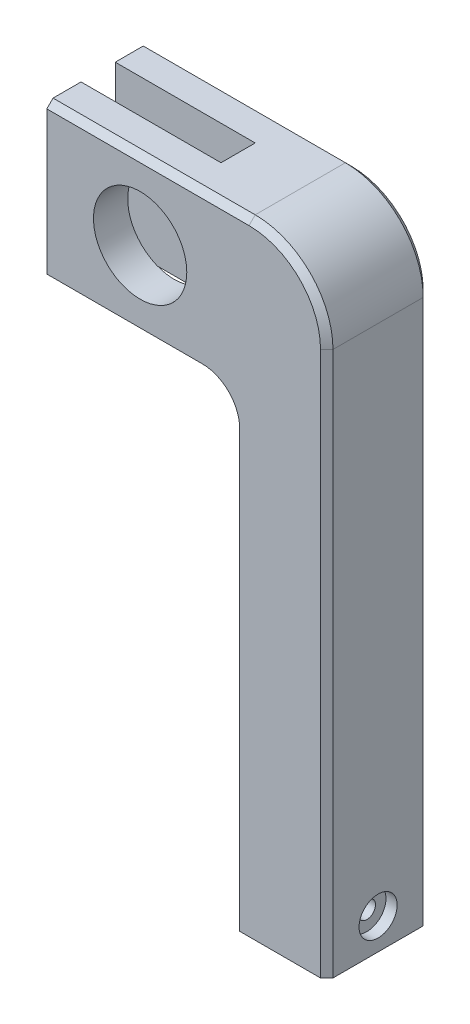
ISO-10303-21;
HEADER;
FILE_DESCRIPTION(('STEP AP214'),'2;1');
FILE_NAME('part.step','',(''),(''),'','','');
FILE_SCHEMA(('AUTOMOTIVE_DESIGN { 1 0 10303 214 1 1 1 1 }'));
ENDSEC;
DATA;
#1=APPLICATION_CONTEXT('core data for automotive mechanical design processes');
#2=APPLICATION_PROTOCOL_DEFINITION('international standard','automotive_design',2000,#1);
#3=PRODUCT_CONTEXT('',#1,'mechanical');
#4=PRODUCT('Part','Part','',(#3));
#5=PRODUCT_RELATED_PRODUCT_CATEGORY('part','',(#4));
#6=PRODUCT_DEFINITION_FORMATION('','',#4);
#7=PRODUCT_DEFINITION_CONTEXT('part definition',#1,'design');
#8=PRODUCT_DEFINITION('design','',#6,#7);
#9=PRODUCT_DEFINITION_SHAPE('','',#8);
#10=(LENGTH_UNIT() NAMED_UNIT(*) SI_UNIT(.MILLI.,.METRE.));
#11=(NAMED_UNIT(*) PLANE_ANGLE_UNIT() SI_UNIT($,.RADIAN.));
#12=(NAMED_UNIT(*) SI_UNIT($,.STERADIAN.) SOLID_ANGLE_UNIT());
#13=UNCERTAINTY_MEASURE_WITH_UNIT(LENGTH_MEASURE(1.E-05),#10,'distance_accuracy_value','');
#14=(GEOMETRIC_REPRESENTATION_CONTEXT(3) GLOBAL_UNCERTAINTY_ASSIGNED_CONTEXT((#13)) GLOBAL_UNIT_ASSIGNED_CONTEXT((#10,
#11,#12)) REPRESENTATION_CONTEXT('',''));
#15=CARTESIAN_POINT('',(0.,0.,0.));
#16=DIRECTION('',(0.,0.,1.));
#17=DIRECTION('',(1.,0.,0.));
#18=AXIS2_PLACEMENT_3D('',#15,#16,#17);
#19=CARTESIAN_POINT('',(-90.,150.,-16.5));
#20=DIRECTION('',(-1.,0.,0.));
#21=DIRECTION('',(0.,0.,1.));
#22=AXIS2_PLACEMENT_3D('',#19,#20,#21);
#23=PLANE('',#22);
#24=CARTESIAN_POINT('',(-90.,195.,-11.));
#25=DIRECTION('',(-1.,0.,0.));
#26=DIRECTION('',(0.,0.,1.));
#27=AXIS2_PLACEMENT_3D('',#24,#25,#26);
#28=CIRCLE('',#27,1.5);
#29=CARTESIAN_POINT('',(-90.,195.,-9.5));
#30=VERTEX_POINT('',#29);
#31=EDGE_CURVE('E213',#30,#30,#28,.T.);
#32=ORIENTED_EDGE('',*,*,#31,.F.);
#33=EDGE_LOOP('',(#32));
#34=FACE_BOUND('',#33,.T.);
#35=CARTESIAN_POINT('',(-90.,155.,-11.));
#36=DIRECTION('',(-1.,0.,0.));
#37=DIRECTION('',(0.,0.,1.));
#38=AXIS2_PLACEMENT_3D('',#35,#36,#37);
#39=CIRCLE('',#38,1.5);
#40=CARTESIAN_POINT('',(-90.,155.,-9.5));
#41=VERTEX_POINT('',#40);
#42=EDGE_CURVE('E215',#41,#41,#39,.T.);
#43=ORIENTED_EDGE('',*,*,#42,.F.);
#44=EDGE_LOOP('',(#43));
#45=FACE_BOUND('',#44,.T.);
#46=DIRECTION('',(0.,-1.,0.));
#47=VECTOR('',#46,1.);
#48=CARTESIAN_POINT('',(-90.,150.,-16.5));
#49=LINE('',#48,#47);
#50=CARTESIAN_POINT('',(-90.,198.,-16.5));
#51=VERTEX_POINT('',#50);
#52=CARTESIAN_POINT('',(-90.,152.,-16.5));
#53=VERTEX_POINT('',#52);
#54=EDGE_CURVE('E298',#51,#53,#49,.T.);
#55=ORIENTED_EDGE('',*,*,#54,.T.);
#56=DIRECTION('',(0.,0.707106781186552,-0.707106781186543));
#57=VECTOR('',#56,1.);
#58=CARTESIAN_POINT('',(-90.,151.,-15.5));
#59=LINE('',#58,#57);
#60=CARTESIAN_POINT('',(-90.,150.,-14.5));
#61=VERTEX_POINT('',#60);
#62=EDGE_CURVE('E421',#53,#61,#59,.F.);
#63=ORIENTED_EDGE('',*,*,#62,.T.);
#64=DIRECTION('',(0.,0.,1.));
#65=VECTOR('',#64,1.);
#66=CARTESIAN_POINT('',(-90.,150.,-16.5));
#67=LINE('',#66,#65);
#68=CARTESIAN_POINT('',(-90.,150.,-5.5));
#69=VERTEX_POINT('',#68);
#70=EDGE_CURVE('E322',#61,#69,#67,.T.);
#71=ORIENTED_EDGE('',*,*,#70,.T.);
#72=DIRECTION('',(0.,1.,0.));
#73=VECTOR('',#72,1.);
#74=CARTESIAN_POINT('',(-90.,-0.001000000000001,-5.5));
#75=LINE('',#74,#73);
#76=CARTESIAN_POINT('',(-90.,200.,-5.5));
#77=VERTEX_POINT('',#76);
#78=EDGE_CURVE('E278',#69,#77,#75,.T.);
#79=ORIENTED_EDGE('',*,*,#78,.T.);
#80=DIRECTION('',(0.,0.,1.));
#81=VECTOR('',#80,1.);
#82=CARTESIAN_POINT('',(-90.,200.,-16.5));
#83=LINE('',#82,#81);
#84=CARTESIAN_POINT('',(-90.,200.,-14.5));
#85=VERTEX_POINT('',#84);
#86=EDGE_CURVE('E327',#85,#77,#83,.T.);
#87=ORIENTED_EDGE('',*,*,#86,.F.);
#88=DIRECTION('',(0.,0.707106781186552,0.707106781186543));
#89=VECTOR('',#88,1.);
#90=CARTESIAN_POINT('',(-90.,174.,-40.5));
#91=LINE('',#90,#89);
#92=EDGE_CURVE('E419',#85,#51,#91,.F.);
#93=ORIENTED_EDGE('',*,*,#92,.T.);
#94=EDGE_LOOP('',(#55,#63,#71,#79,#87,#93));
#95=FACE_BOUND('',#94,.T.);
#96=ADVANCED_FACE('F50',(#34,#45,#95),#23,.T.);
#97=CARTESIAN_POINT('',(-30.,150.,-16.5));
#98=DIRECTION('',(0.,-1.,0.));
#99=DIRECTION('',(0.,0.,-1.));
#100=AXIS2_PLACEMENT_3D('',#97,#98,#99);
#101=PLANE('',#100);
#102=DIRECTION('',(0.,0.,1.));
#103=VECTOR('',#102,1.);
#104=CARTESIAN_POINT('',(-40.,150.,16.5));
#105=LINE('',#104,#103);
#106=CARTESIAN_POINT('',(-40.,150.,-14.5));
#107=VERTEX_POINT('',#106);
#108=CARTESIAN_POINT('',(-40.,150.,14.4999999999999));
#109=VERTEX_POINT('',#108);
#110=EDGE_CURVE('E337',#107,#109,#105,.T.);
#111=ORIENTED_EDGE('',*,*,#110,.T.);
#112=DIRECTION('',(-1.,0.,0.));
#113=VECTOR('',#112,1.);
#114=CARTESIAN_POINT('',(-90.,150.,14.4999999999999));
#115=LINE('',#114,#113);
#116=CARTESIAN_POINT('',(-90.,150.,14.4999999999999));
#117=VERTEX_POINT('',#116);
#118=EDGE_CURVE('E369',#109,#117,#115,.T.);
#119=ORIENTED_EDGE('',*,*,#118,.T.);
#120=CARTESIAN_POINT('',(-90.,150.,5.5));
#121=VERTEX_POINT('',#120);
#122=EDGE_CURVE('E330',#121,#117,#67,.T.);
#123=ORIENTED_EDGE('',*,*,#122,.F.);
#124=DIRECTION('',(1.,0.,0.));
#125=VECTOR('',#124,1.);
#126=CARTESIAN_POINT('',(-45.,150.,5.49999999999999));
#127=LINE('',#126,#125);
#128=CARTESIAN_POINT('',(-45.,150.,5.49999999999999));
#129=VERTEX_POINT('',#128);
#130=EDGE_CURVE('E283',#121,#129,#127,.T.);
#131=ORIENTED_EDGE('',*,*,#130,.T.);
#132=DIRECTION('',(0.,0.,-1.));
#133=VECTOR('',#132,1.);
#134=CARTESIAN_POINT('',(-45.,150.,5.49999999999999));
#135=LINE('',#134,#133);
#136=CARTESIAN_POINT('',(-45.,150.,-5.49999999999999));
#137=VERTEX_POINT('',#136);
#138=EDGE_CURVE('E259',#129,#137,#135,.T.);
#139=ORIENTED_EDGE('',*,*,#138,.T.);
#140=DIRECTION('',(-1.,0.,0.));
#141=VECTOR('',#140,1.);
#142=CARTESIAN_POINT('',(-45.,150.,-5.49999999999999));
#143=LINE('',#142,#141);
#144=EDGE_CURVE('E263',#137,#69,#143,.T.);
#145=ORIENTED_EDGE('',*,*,#144,.T.);
#146=ORIENTED_EDGE('',*,*,#70,.F.);
#147=DIRECTION('',(1.,0.,0.));
#148=VECTOR('',#147,1.);
#149=CARTESIAN_POINT('',(-30.,150.,-14.5));
#150=LINE('',#149,#148);
#151=EDGE_CURVE('E364',#61,#107,#150,.T.);
#152=ORIENTED_EDGE('',*,*,#151,.T.);
#153=EDGE_LOOP('',(#111,#119,#123,#131,#139,#145,#146,#152));
#154=FACE_BOUND('',#153,.T.);
#155=ADVANCED_FACE('F492',(#154),#101,.T.);
#156=CARTESIAN_POINT('',(0.,200.,-16.5));
#157=DIRECTION('',(1.,0.,0.));
#158=DIRECTION('',(0.,1.,0.));
#159=AXIS2_PLACEMENT_3D('',#156,#157,#158);
#160=PLANE('',#159);
#161=CARTESIAN_POINT('',(0.,10.,0.));
#162=DIRECTION('',(1.,0.,0.));
#163=DIRECTION('',(0.,0.,-1.));
#164=AXIS2_PLACEMENT_3D('',#161,#162,#163);
#165=CIRCLE('',#164,6.12);
#166=CARTESIAN_POINT('',(0.,10.,-6.12));
#167=VERTEX_POINT('',#166);
#168=EDGE_CURVE('E483',#167,#167,#165,.T.);
#169=ORIENTED_EDGE('',*,*,#168,.F.);
#170=EDGE_LOOP('',(#169));
#171=FACE_BOUND('',#170,.T.);
#172=DIRECTION('',(0.,0.,1.));
#173=VECTOR('',#172,1.);
#174=CARTESIAN_POINT('',(0.,0.,-16.5));
#175=LINE('',#174,#173);
#176=CARTESIAN_POINT('',(0.,0.,-14.5));
#177=VERTEX_POINT('',#176);
#178=CARTESIAN_POINT('',(0.,0.,14.4999999999999));
#179=VERTEX_POINT('',#178);
#180=EDGE_CURVE('E312',#177,#179,#175,.T.);
#181=ORIENTED_EDGE('',*,*,#180,.F.);
#182=DIRECTION('',(0.,1.,0.));
#183=VECTOR('',#182,1.);
#184=CARTESIAN_POINT('',(0.,200.,-14.5));
#185=LINE('',#184,#183);
#186=CARTESIAN_POINT('',(0.,175.,-14.5));
#187=VERTEX_POINT('',#186);
#188=EDGE_CURVE('E11',#177,#187,#185,.T.);
#189=ORIENTED_EDGE('',*,*,#188,.T.);
#190=DIRECTION('',(0.,0.,1.));
#191=VECTOR('',#190,1.);
#192=CARTESIAN_POINT('',(0.,175.,-16.5));
#193=LINE('',#192,#191);
#194=CARTESIAN_POINT('',(0.,175.,14.4999999999999));
#195=VERTEX_POINT('',#194);
#196=EDGE_CURVE('E317',#187,#195,#193,.T.);
#197=ORIENTED_EDGE('',*,*,#196,.T.);
#198=DIRECTION('',(0.,-1.,0.));
#199=VECTOR('',#198,1.);
#200=CARTESIAN_POINT('',(0.,0.,14.4999999999999));
#201=LINE('',#200,#199);
#202=EDGE_CURVE('E59',#195,#179,#201,.T.);
#203=ORIENTED_EDGE('',*,*,#202,.T.);
#204=EDGE_LOOP('',(#181,#189,#197,#203));
#205=FACE_BOUND('',#204,.T.);
#206=ADVANCED_FACE('F489',(#171,#205),#160,.T.);
#207=CARTESIAN_POINT('',(0.,0.,-16.5));
#208=DIRECTION('',(0.,-1.,0.));
#209=DIRECTION('',(1.,0.,0.));
#210=AXIS2_PLACEMENT_3D('',#207,#208,#209);
#211=PLANE('',#210);
#212=DIRECTION('',(1.,0.,0.));
#213=VECTOR('',#212,1.);
#214=CARTESIAN_POINT('',(0.,0.,16.5));
#215=LINE('',#214,#213);
#216=CARTESIAN_POINT('',(-28.,0.,16.5));
#217=VERTEX_POINT('',#216);
#218=CARTESIAN_POINT('',(-2.00000000000003,0.,16.5));
#219=VERTEX_POINT('',#218);
#220=EDGE_CURVE('E303',#217,#219,#215,.T.);
#221=ORIENTED_EDGE('',*,*,#220,.F.);
#222=DIRECTION('',(-0.707106781186543,0.,-0.707106781186552));
#223=VECTOR('',#222,1.);
#224=CARTESIAN_POINT('',(-30.5000000000002,0.,13.9999999999998));
#225=LINE('',#224,#223);
#226=CARTESIAN_POINT('',(-30.,0.,14.4999999999999));
#227=VERTEX_POINT('',#226);
#228=EDGE_CURVE('E394',#217,#227,#225,.T.);
#229=ORIENTED_EDGE('',*,*,#228,.T.);
#230=DIRECTION('',(0.,0.,1.));
#231=VECTOR('',#230,1.);
#232=CARTESIAN_POINT('',(-30.,0.,-16.5));
#233=LINE('',#232,#231);
#234=CARTESIAN_POINT('',(-30.,0.,-14.5));
#235=VERTEX_POINT('',#234);
#236=EDGE_CURVE('E319',#235,#227,#233,.T.);
#237=ORIENTED_EDGE('',*,*,#236,.F.);
#238=DIRECTION('',(-0.707106781186552,0.,0.707106781186543));
#239=VECTOR('',#238,1.);
#240=CARTESIAN_POINT('',(-13.9999999999998,0.,-30.5));
#241=LINE('',#240,#239);
#242=CARTESIAN_POINT('',(-28.,0.,-16.5));
#243=VERTEX_POINT('',#242);
#244=EDGE_CURVE('E388',#235,#243,#241,.F.);
#245=ORIENTED_EDGE('',*,*,#244,.T.);
#246=DIRECTION('',(1.,0.,0.));
#247=VECTOR('',#246,1.);
#248=CARTESIAN_POINT('',(0.,0.,-16.5));
#249=LINE('',#248,#247);
#250=CARTESIAN_POINT('',(-2.00000000000006,0.,-16.5));
#251=VERTEX_POINT('',#250);
#252=EDGE_CURVE('E305',#243,#251,#249,.T.);
#253=ORIENTED_EDGE('',*,*,#252,.T.);
#254=DIRECTION('',(-0.707106781186552,0.,-0.707106781186543));
#255=VECTOR('',#254,1.);
#256=CARTESIAN_POINT('',(-1.00000000000001,0.,-15.5));
#257=LINE('',#256,#255);
#258=EDGE_CURVE('E390',#251,#177,#257,.F.);
#259=ORIENTED_EDGE('',*,*,#258,.T.);
#260=ORIENTED_EDGE('',*,*,#180,.T.);
#261=DIRECTION('',(-0.707106781186543,0.,0.707106781186552));
#262=VECTOR('',#261,1.);
#263=CARTESIAN_POINT('',(15.5,0.,-1.00000000000024));
#264=LINE('',#263,#262);
#265=EDGE_CURVE('E383',#179,#219,#264,.T.);
#266=ORIENTED_EDGE('',*,*,#265,.T.);
#267=EDGE_LOOP('',(#221,#229,#237,#245,#253,#259,#260,#266));
#268=FACE_BOUND('',#267,.T.);
#269=ADVANCED_FACE('F495',(#268),#211,.T.);
#270=CARTESIAN_POINT('',(-30.,150.,-16.5));
#271=DIRECTION('',(-1.,0.,0.));
#272=DIRECTION('',(0.,-1.,0.));
#273=AXIS2_PLACEMENT_3D('',#270,#271,#272);
#274=PLANE('',#273);
#275=CARTESIAN_POINT('',(-30.,10.,0.));
#276=DIRECTION('',(-1.,0.,0.));
#277=DIRECTION('',(0.,-1.,0.));
#278=AXIS2_PLACEMENT_3D('',#275,#276,#277);
#279=CIRCLE('',#278,2.75);
#280=CARTESIAN_POINT('',(-30.,7.25,0.));
#281=VERTEX_POINT('',#280);
#282=EDGE_CURVE('E464',#281,#281,#279,.T.);
#283=ORIENTED_EDGE('',*,*,#282,.F.);
#284=EDGE_LOOP('',(#283));
#285=FACE_BOUND('',#284,.T.);
#286=ORIENTED_EDGE('',*,*,#236,.T.);
#287=DIRECTION('',(0.,1.,0.));
#288=VECTOR('',#287,1.);
#289=CARTESIAN_POINT('',(-30.,140.,14.4999999999999));
#290=LINE('',#289,#288);
#291=CARTESIAN_POINT('',(-30.,140.,14.4999999999999));
#292=VERTEX_POINT('',#291);
#293=EDGE_CURVE('E398',#227,#292,#290,.T.);
#294=ORIENTED_EDGE('',*,*,#293,.T.);
#295=DIRECTION('',(0.,0.,1.));
#296=VECTOR('',#295,1.);
#297=CARTESIAN_POINT('',(-30.,140.,-16.5));
#298=LINE('',#297,#296);
#299=CARTESIAN_POINT('',(-30.,140.,-14.5));
#300=VERTEX_POINT('',#299);
#301=EDGE_CURVE('E344',#292,#300,#298,.F.);
#302=ORIENTED_EDGE('',*,*,#301,.T.);
#303=DIRECTION('',(0.,-1.,0.));
#304=VECTOR('',#303,1.);
#305=CARTESIAN_POINT('',(-30.,150.,-14.5));
#306=LINE('',#305,#304);
#307=EDGE_CURVE('E399',#300,#235,#306,.T.);
#308=ORIENTED_EDGE('',*,*,#307,.T.);
#309=EDGE_LOOP('',(#286,#294,#302,#308));
#310=FACE_BOUND('',#309,.T.);
#311=ADVANCED_FACE('F561',(#285,#310),#274,.T.);
#312=CARTESIAN_POINT('',(-90.,195.,11.));
#313=DIRECTION('',(-1.,0.,0.));
#314=DIRECTION('',(0.,0.,1.));
#315=AXIS2_PLACEMENT_3D('',#312,#313,#314);
#316=CIRCLE('',#315,1.5);
#317=CARTESIAN_POINT('',(-90.,195.,12.5));
#318=VERTEX_POINT('',#317);
#319=EDGE_CURVE('E229',#318,#318,#316,.T.);
#320=ORIENTED_EDGE('',*,*,#319,.F.);
#321=EDGE_LOOP('',(#320));
#322=FACE_BOUND('',#321,.T.);
#323=CARTESIAN_POINT('',(-90.,155.,11.));
#324=DIRECTION('',(-1.,0.,0.));
#325=DIRECTION('',(0.,0.,1.));
#326=AXIS2_PLACEMENT_3D('',#323,#324,#325);
#327=CIRCLE('',#326,1.5);
#328=CARTESIAN_POINT('',(-90.,155.,12.5));
#329=VERTEX_POINT('',#328);
#330=EDGE_CURVE('E237',#329,#329,#327,.T.);
#331=ORIENTED_EDGE('',*,*,#330,.F.);
#332=EDGE_LOOP('',(#331));
#333=FACE_BOUND('',#332,.T.);
#334=ORIENTED_EDGE('',*,*,#122,.T.);
#335=DIRECTION('',(0.,0.707106781186543,0.707106781186552));
#336=VECTOR('',#335,1.);
#337=CARTESIAN_POINT('',(-90.,134.5,-1.00000000000024));
#338=LINE('',#337,#336);
#339=CARTESIAN_POINT('',(-90.,152.,16.5));
#340=VERTEX_POINT('',#339);
#341=EDGE_CURVE('E374',#117,#340,#338,.T.);
#342=ORIENTED_EDGE('',*,*,#341,.T.);
#343=DIRECTION('',(0.,-1.,0.));
#344=VECTOR('',#343,1.);
#345=CARTESIAN_POINT('',(-90.,150.,16.5));
#346=LINE('',#345,#344);
#347=CARTESIAN_POINT('',(-90.,198.,16.5));
#348=VERTEX_POINT('',#347);
#349=EDGE_CURVE('E299',#348,#340,#346,.T.);
#350=ORIENTED_EDGE('',*,*,#349,.F.);
#351=DIRECTION('',(0.,0.707106781186543,-0.707106781186552));
#352=VECTOR('',#351,1.);
#353=CARTESIAN_POINT('',(-90.,190.5,23.9999999999998));
#354=LINE('',#353,#352);
#355=CARTESIAN_POINT('',(-90.,200.,14.4999999999999));
#356=VERTEX_POINT('',#355);
#357=EDGE_CURVE('E375',#348,#356,#354,.T.);
#358=ORIENTED_EDGE('',*,*,#357,.T.);
#359=CARTESIAN_POINT('',(-90.,200.,5.5));
#360=VERTEX_POINT('',#359);
#361=EDGE_CURVE('E306',#360,#356,#83,.T.);
#362=ORIENTED_EDGE('',*,*,#361,.F.);
#363=DIRECTION('',(0.,1.,0.));
#364=VECTOR('',#363,1.);
#365=CARTESIAN_POINT('',(-90.,-0.001000000000001,5.5));
#366=LINE('',#365,#364);
#367=EDGE_CURVE('E276',#121,#360,#366,.T.);
#368=ORIENTED_EDGE('',*,*,#367,.F.);
#369=EDGE_LOOP('',(#334,#342,#350,#358,#362,#368));
#370=FACE_BOUND('',#369,.T.);
#371=ADVANCED_FACE('F523',(#322,#333,#370),#23,.T.);
#372=CARTESIAN_POINT('',(-90.,200.,-16.5));
#373=DIRECTION('',(0.,1.,0.));
#374=DIRECTION('',(0.,0.,1.));
#375=AXIS2_PLACEMENT_3D('',#372,#373,#374);
#376=PLANE('',#375);
#377=DIRECTION('',(0.,0.,1.));
#378=VECTOR('',#377,1.);
#379=CARTESIAN_POINT('',(-25.,200.,-16.5));
#380=LINE('',#379,#378);
#381=CARTESIAN_POINT('',(-25.,200.,14.4999999999999));
#382=VERTEX_POINT('',#381);
#383=CARTESIAN_POINT('',(-25.,200.,-14.5));
#384=VERTEX_POINT('',#383);
#385=EDGE_CURVE('E334',#382,#384,#380,.F.);
#386=ORIENTED_EDGE('',*,*,#385,.T.);
#387=DIRECTION('',(-1.,0.,0.));
#388=VECTOR('',#387,1.);
#389=CARTESIAN_POINT('',(-90.,200.,-14.5));
#390=LINE('',#389,#388);
#391=EDGE_CURVE('E427',#384,#85,#390,.T.);
#392=ORIENTED_EDGE('',*,*,#391,.T.);
#393=ORIENTED_EDGE('',*,*,#86,.T.);
#394=DIRECTION('',(-1.,0.,0.));
#395=VECTOR('',#394,1.);
#396=CARTESIAN_POINT('',(-45.,200.,-5.49999999999999));
#397=LINE('',#396,#395);
#398=CARTESIAN_POINT('',(-45.,200.,-5.49999999999999));
#399=VERTEX_POINT('',#398);
#400=EDGE_CURVE('E274',#399,#77,#397,.T.);
#401=ORIENTED_EDGE('',*,*,#400,.F.);
#402=DIRECTION('',(0.,0.,-1.));
#403=VECTOR('',#402,1.);
#404=CARTESIAN_POINT('',(-45.,200.,5.49999999999999));
#405=LINE('',#404,#403);
#406=CARTESIAN_POINT('',(-45.,200.,5.49999999999999));
#407=VERTEX_POINT('',#406);
#408=EDGE_CURVE('E271',#407,#399,#405,.T.);
#409=ORIENTED_EDGE('',*,*,#408,.F.);
#410=DIRECTION('',(1.,0.,0.));
#411=VECTOR('',#410,1.);
#412=CARTESIAN_POINT('',(-45.,200.,5.49999999999999));
#413=LINE('',#412,#411);
#414=EDGE_CURVE('E270',#360,#407,#413,.T.);
#415=ORIENTED_EDGE('',*,*,#414,.F.);
#416=ORIENTED_EDGE('',*,*,#361,.T.);
#417=DIRECTION('',(1.,0.,0.));
#418=VECTOR('',#417,1.);
#419=CARTESIAN_POINT('',(-25.,200.,14.4999999999999));
#420=LINE('',#419,#418);
#421=EDGE_CURVE('E426',#356,#382,#420,.T.);
#422=ORIENTED_EDGE('',*,*,#421,.T.);
#423=EDGE_LOOP('',(#386,#392,#393,#401,#409,#415,#416,#422));
#424=FACE_BOUND('',#423,.T.);
#425=ADVANCED_FACE('F512',(#424),#376,.T.);
#426=CARTESIAN_POINT('',(0.,0.,-16.5));
#427=DIRECTION('',(0.,0.,-1.));
#428=DIRECTION('',(-1.,0.,0.));
#429=AXIS2_PLACEMENT_3D('',#426,#427,#428);
#430=PLANE('',#429);
#431=CARTESIAN_POINT('',(-60.,175.,-16.5));
#432=DIRECTION('',(0.,0.,-1.));
#433=DIRECTION('',(-1.,0.,0.));
#434=AXIS2_PLACEMENT_3D('',#431,#432,#433);
#435=CIRCLE('',#434,9.75);
#436=CARTESIAN_POINT('',(-69.75,175.,-16.5));
#437=VERTEX_POINT('',#436);
#438=EDGE_CURVE('E243',#437,#437,#435,.T.);
#439=ORIENTED_EDGE('',*,*,#438,.F.);
#440=EDGE_LOOP('',(#439));
#441=FACE_BOUND('',#440,.T.);
#442=CARTESIAN_POINT('',(-40.,140.,-16.5));
#443=DIRECTION('',(0.,0.,-1.));
#444=DIRECTION('',(-1.,0.,0.));
#445=AXIS2_PLACEMENT_3D('',#442,#443,#444);
#446=CIRCLE('',#445,12.);
#447=CARTESIAN_POINT('',(-28.,140.,-16.5));
#448=VERTEX_POINT('',#447);
#449=CARTESIAN_POINT('',(-40.,152.,-16.5));
#450=VERTEX_POINT('',#449);
#451=EDGE_CURVE('E413',#448,#450,#446,.F.);
#452=ORIENTED_EDGE('',*,*,#451,.T.);
#453=DIRECTION('',(-1.,0.,0.));
#454=VECTOR('',#453,1.);
#455=CARTESIAN_POINT('',(0.,152.,-16.5));
#456=LINE('',#455,#454);
#457=EDGE_CURVE('E417',#450,#53,#456,.T.);
#458=ORIENTED_EDGE('',*,*,#457,.T.);
#459=ORIENTED_EDGE('',*,*,#54,.F.);
#460=DIRECTION('',(1.,0.,0.));
#461=VECTOR('',#460,1.);
#462=CARTESIAN_POINT('',(0.,198.,-16.5));
#463=LINE('',#462,#461);
#464=CARTESIAN_POINT('',(-25.,198.,-16.5));
#465=VERTEX_POINT('',#464);
#466=EDGE_CURVE('E409',#51,#465,#463,.T.);
#467=ORIENTED_EDGE('',*,*,#466,.T.);
#468=CARTESIAN_POINT('',(-25.,175.,-16.5));
#469=DIRECTION('',(0.,0.,-1.));
#470=DIRECTION('',(-1.,0.,0.));
#471=AXIS2_PLACEMENT_3D('',#468,#469,#470);
#472=CIRCLE('',#471,22.9999999999999);
#473=CARTESIAN_POINT('',(-2.00000000000004,175.,-16.5));
#474=VERTEX_POINT('',#473);
#475=EDGE_CURVE('E403',#465,#474,#472,.T.);
#476=ORIENTED_EDGE('',*,*,#475,.T.);
#477=DIRECTION('',(0.,-1.,0.));
#478=VECTOR('',#477,1.);
#479=CARTESIAN_POINT('',(-2.00000000000006,0.,-16.5));
#480=LINE('',#479,#478);
#481=EDGE_CURVE('E405',#474,#251,#480,.T.);
#482=ORIENTED_EDGE('',*,*,#481,.T.);
#483=ORIENTED_EDGE('',*,*,#252,.F.);
#484=DIRECTION('',(0.,1.,0.));
#485=VECTOR('',#484,1.);
#486=CARTESIAN_POINT('',(-28.,0.,-16.5));
#487=LINE('',#486,#485);
#488=EDGE_CURVE('E414',#243,#448,#487,.T.);
#489=ORIENTED_EDGE('',*,*,#488,.T.);
#490=EDGE_LOOP('',(#452,#458,#459,#467,#476,#482,#483,#489));
#491=FACE_BOUND('',#490,.T.);
#492=ADVANCED_FACE('F568',(#441,#491),#430,.T.);
#493=CARTESIAN_POINT('',(0.,0.,16.5));
#494=DIRECTION('',(0.,0.,-1.));
#495=DIRECTION('',(-1.,0.,0.));
#496=AXIS2_PLACEMENT_3D('',#493,#494,#495);
#497=PLANE('',#496);
#498=CARTESIAN_POINT('',(-60.,175.,16.5));
#499=DIRECTION('',(0.,0.,1.));
#500=DIRECTION('',(1.,0.,0.));
#501=AXIS2_PLACEMENT_3D('',#498,#499,#500);
#502=CIRCLE('',#501,15.);
#503=CARTESIAN_POINT('',(-45.,175.,16.5));
#504=VERTEX_POINT('',#503);
#505=EDGE_CURVE('E254',#504,#504,#502,.T.);
#506=ORIENTED_EDGE('',*,*,#505,.F.);
#507=EDGE_LOOP('',(#506));
#508=FACE_BOUND('',#507,.T.);
#509=ORIENTED_EDGE('',*,*,#349,.T.);
#510=DIRECTION('',(1.,0.,0.));
#511=VECTOR('',#510,1.);
#512=CARTESIAN_POINT('',(-40.,152.,16.5));
#513=LINE('',#512,#511);
#514=CARTESIAN_POINT('',(-40.,152.,16.5));
#515=VERTEX_POINT('',#514);
#516=EDGE_CURVE('E363',#340,#515,#513,.T.);
#517=ORIENTED_EDGE('',*,*,#516,.T.);
#518=CARTESIAN_POINT('',(-40.,140.,16.5));
#519=DIRECTION('',(0.,0.,-1.));
#520=DIRECTION('',(-1.,0.,0.));
#521=AXIS2_PLACEMENT_3D('',#518,#519,#520);
#522=CIRCLE('',#521,12.);
#523=CARTESIAN_POINT('',(-28.,140.,16.5));
#524=VERTEX_POINT('',#523);
#525=EDGE_CURVE('E360',#515,#524,#522,.T.);
#526=ORIENTED_EDGE('',*,*,#525,.T.);
#527=DIRECTION('',(0.,-1.,0.));
#528=VECTOR('',#527,1.);
#529=CARTESIAN_POINT('',(-28.,0.,16.5));
#530=LINE('',#529,#528);
#531=EDGE_CURVE('E355',#524,#217,#530,.T.);
#532=ORIENTED_EDGE('',*,*,#531,.T.);
#533=ORIENTED_EDGE('',*,*,#220,.T.);
#534=DIRECTION('',(0.,1.,0.));
#535=VECTOR('',#534,1.);
#536=CARTESIAN_POINT('',(-2.00000000000001,175.,16.5));
#537=LINE('',#536,#535);
#538=CARTESIAN_POINT('',(-2.00000000000001,175.,16.5));
#539=VERTEX_POINT('',#538);
#540=EDGE_CURVE('E342',#219,#539,#537,.T.);
#541=ORIENTED_EDGE('',*,*,#540,.T.);
#542=CARTESIAN_POINT('',(-25.,175.,16.5));
#543=DIRECTION('',(0.,0.,-1.));
#544=DIRECTION('',(-1.,0.,0.));
#545=AXIS2_PLACEMENT_3D('',#542,#543,#544);
#546=CIRCLE('',#545,23.);
#547=CARTESIAN_POINT('',(-25.,198.,16.5));
#548=VERTEX_POINT('',#547);
#549=EDGE_CURVE('E346',#539,#548,#546,.F.);
#550=ORIENTED_EDGE('',*,*,#549,.T.);
#551=DIRECTION('',(-1.,0.,0.));
#552=VECTOR('',#551,1.);
#553=CARTESIAN_POINT('',(-90.,198.,16.5));
#554=LINE('',#553,#552);
#555=EDGE_CURVE('E351',#548,#348,#554,.T.);
#556=ORIENTED_EDGE('',*,*,#555,.T.);
#557=EDGE_LOOP('',(#509,#517,#526,#532,#533,#541,#550,#556));
#558=FACE_BOUND('',#557,.T.);
#559=ADVANCED_FACE('F520',(#508,#558),#497,.F.);
#560=CARTESIAN_POINT('',(-45.,-0.001000000000001,-5.49999999999999));
#561=DIRECTION('',(0.,0.,-1.));
#562=DIRECTION('',(-1.,0.,0.));
#563=AXIS2_PLACEMENT_3D('',#560,#561,#562);
#564=PLANE('',#563);
#565=CARTESIAN_POINT('',(-60.,175.,-5.5));
#566=DIRECTION('',(0.,0.,-1.));
#567=DIRECTION('',(-1.,0.,0.));
#568=AXIS2_PLACEMENT_3D('',#565,#566,#567);
#569=CIRCLE('',#568,9.75);
#570=CARTESIAN_POINT('',(-69.75,175.,-5.5));
#571=VERTEX_POINT('',#570);
#572=EDGE_CURVE('E250',#571,#571,#569,.F.);
#573=ORIENTED_EDGE('',*,*,#572,.F.);
#574=EDGE_LOOP('',(#573));
#575=FACE_BOUND('',#574,.T.);
#576=DIRECTION('',(0.,1.,0.));
#577=VECTOR('',#576,1.);
#578=CARTESIAN_POINT('',(-45.,-0.001000000000001,-5.49999999999999));
#579=LINE('',#578,#577);
#580=EDGE_CURVE('E285',#137,#399,#579,.T.);
#581=ORIENTED_EDGE('',*,*,#580,.T.);
#582=ORIENTED_EDGE('',*,*,#400,.T.);
#583=ORIENTED_EDGE('',*,*,#78,.F.);
#584=ORIENTED_EDGE('',*,*,#144,.F.);
#585=EDGE_LOOP('',(#581,#582,#583,#584));
#586=FACE_BOUND('',#585,.T.);
#587=ADVANCED_FACE('F577',(#575,#586),#564,.F.);
#588=CARTESIAN_POINT('',(-45.,-0.001000000000001,5.49999999999999));
#589=DIRECTION('',(1.,0.,0.));
#590=DIRECTION('',(0.,0.,-1.));
#591=AXIS2_PLACEMENT_3D('',#588,#589,#590);
#592=PLANE('',#591);
#593=DIRECTION('',(0.,1.,0.));
#594=VECTOR('',#593,1.);
#595=CARTESIAN_POINT('',(-45.,-0.001000000000001,5.49999999999999));
#596=LINE('',#595,#594);
#597=CARTESIAN_POINT('',(-45.,175.,5.5));
#598=VERTEX_POINT('',#597);
#599=EDGE_CURVE('E290',#129,#598,#596,.T.);
#600=ORIENTED_EDGE('',*,*,#599,.T.);
#601=EDGE_CURVE('E295',#598,#407,#596,.T.);
#602=ORIENTED_EDGE('',*,*,#601,.T.);
#603=ORIENTED_EDGE('',*,*,#408,.T.);
#604=ORIENTED_EDGE('',*,*,#580,.F.);
#605=ORIENTED_EDGE('',*,*,#138,.F.);
#606=EDGE_LOOP('',(#600,#602,#603,#604,#605));
#607=FACE_BOUND('',#606,.T.);
#608=ADVANCED_FACE('F581',(#607),#592,.F.);
#609=CARTESIAN_POINT('',(-45.,-0.001000000000001,5.49999999999999));
#610=DIRECTION('',(0.,0.,1.));
#611=DIRECTION('',(1.,0.,0.));
#612=AXIS2_PLACEMENT_3D('',#609,#610,#611);
#613=PLANE('',#612);
#614=ORIENTED_EDGE('',*,*,#601,.F.);
#615=CARTESIAN_POINT('',(-60.,175.,5.5));
#616=DIRECTION('',(0.,0.,1.));
#617=DIRECTION('',(1.,0.,0.));
#618=AXIS2_PLACEMENT_3D('',#615,#616,#617);
#619=CIRCLE('',#618,15.);
#620=EDGE_CURVE('E252',#598,#598,#619,.F.);
#621=ORIENTED_EDGE('',*,*,#620,.F.);
#622=ORIENTED_EDGE('',*,*,#599,.F.);
#623=ORIENTED_EDGE('',*,*,#130,.F.);
#624=ORIENTED_EDGE('',*,*,#367,.T.);
#625=ORIENTED_EDGE('',*,*,#414,.T.);
#626=EDGE_LOOP('',(#614,#621,#622,#623,#624,#625));
#627=FACE_BOUND('',#626,.T.);
#628=ADVANCED_FACE('F587',(#627),#613,.F.);
#629=CARTESIAN_POINT('',(-25.,175.,-16.5));
#630=DIRECTION('',(0.,0.,1.));
#631=DIRECTION('',(1.,0.,0.));
#632=AXIS2_PLACEMENT_3D('',#629,#630,#631);
#633=CYLINDRICAL_SURFACE('',#632,25.);
#634=ORIENTED_EDGE('',*,*,#196,.F.);
#635=CARTESIAN_POINT('',(-25.,175.,-14.5));
#636=DIRECTION('',(0.,0.,-1.));
#637=DIRECTION('',(-1.,0.,0.));
#638=AXIS2_PLACEMENT_3D('',#635,#636,#637);
#639=CIRCLE('',#638,25.);
#640=EDGE_CURVE('E434',#187,#384,#639,.F.);
#641=ORIENTED_EDGE('',*,*,#640,.T.);
#642=ORIENTED_EDGE('',*,*,#385,.F.);
#643=CARTESIAN_POINT('',(-25.,175.,14.4999999999999));
#644=DIRECTION('',(0.,0.,-1.));
#645=DIRECTION('',(-1.,0.,0.));
#646=AXIS2_PLACEMENT_3D('',#643,#644,#645);
#647=CIRCLE('',#646,25.);
#648=EDGE_CURVE('E69',#382,#195,#647,.T.);
#649=ORIENTED_EDGE('',*,*,#648,.T.);
#650=EDGE_LOOP('',(#634,#641,#642,#649));
#651=FACE_BOUND('',#650,.T.);
#652=ADVANCED_FACE('F508',(#651),#633,.T.);
#653=CARTESIAN_POINT('',(-40.,140.,-16.5));
#654=DIRECTION('',(0.,0.,-1.));
#655=DIRECTION('',(-1.,0.,0.));
#656=AXIS2_PLACEMENT_3D('',#653,#654,#655);
#657=CYLINDRICAL_SURFACE('',#656,10.);
#658=ORIENTED_EDGE('',*,*,#301,.F.);
#659=CARTESIAN_POINT('',(-40.,140.,14.4999999999999));
#660=DIRECTION('',(0.,0.,-1.));
#661=DIRECTION('',(-1.,0.,0.));
#662=AXIS2_PLACEMENT_3D('',#659,#660,#661);
#663=CIRCLE('',#662,10.);
#664=EDGE_CURVE('E381',#292,#109,#663,.F.);
#665=ORIENTED_EDGE('',*,*,#664,.T.);
#666=ORIENTED_EDGE('',*,*,#110,.F.);
#667=CARTESIAN_POINT('',(-40.,140.,-14.5));
#668=DIRECTION('',(0.,0.,-1.));
#669=DIRECTION('',(-1.,0.,0.));
#670=AXIS2_PLACEMENT_3D('',#667,#668,#669);
#671=CIRCLE('',#670,10.);
#672=EDGE_CURVE('E378',#107,#300,#671,.T.);
#673=ORIENTED_EDGE('',*,*,#672,.T.);
#674=EDGE_LOOP('',(#658,#665,#666,#673));
#675=FACE_BOUND('',#674,.T.);
#676=ADVANCED_FACE('F546',(#675),#657,.F.);
#677=CARTESIAN_POINT('',(-60.,175.,-16.501));
#678=DIRECTION('',(0.,0.,1.));
#679=DIRECTION('',(1.,0.,0.));
#680=AXIS2_PLACEMENT_3D('',#677,#678,#679);
#681=CYLINDRICAL_SURFACE('',#680,15.);
#682=ORIENTED_EDGE('',*,*,#505,.T.);
#683=EDGE_LOOP('',(#682));
#684=FACE_BOUND('',#683,.T.);
#685=ORIENTED_EDGE('',*,*,#620,.T.);
#686=EDGE_LOOP('',(#685));
#687=FACE_BOUND('',#686,.T.);
#688=ADVANCED_FACE('F593',(#684,#687),#681,.F.);
#689=CARTESIAN_POINT('',(-60.,175.,16.501));
#690=DIRECTION('',(0.,0.,-1.));
#691=DIRECTION('',(-1.,0.,0.));
#692=AXIS2_PLACEMENT_3D('',#689,#690,#691);
#693=CYLINDRICAL_SURFACE('',#692,9.75);
#694=ORIENTED_EDGE('',*,*,#438,.T.);
#695=EDGE_LOOP('',(#694));
#696=FACE_BOUND('',#695,.T.);
#697=ORIENTED_EDGE('',*,*,#572,.T.);
#698=EDGE_LOOP('',(#697));
#699=FACE_BOUND('',#698,.T.);
#700=ADVANCED_FACE('F594',(#696,#699),#693,.F.);
#701=CARTESIAN_POINT('',(-70.9012909285413,155.,11.));
#702=DIRECTION('',(-1.,0.,0.));
#703=DIRECTION('',(0.,0.,1.));
#704=AXIS2_PLACEMENT_3D('',#701,#702,#703);
#705=CONICAL_SURFACE('',#704,1.5,1.02974425867666);
#706=CARTESIAN_POINT('',(-70.,155.,11.));
#707=VERTEX_POINT('',#706);
#708=VERTEX_LOOP('',#707);
#709=FACE_BOUND('',#708,.T.);
#710=CARTESIAN_POINT('',(-70.9012909285413,155.,11.));
#711=DIRECTION('',(-1.,0.,0.));
#712=DIRECTION('',(0.,0.,1.));
#713=AXIS2_PLACEMENT_3D('',#710,#711,#712);
#714=CIRCLE('',#713,1.5);
#715=CARTESIAN_POINT('',(-70.9012909285413,155.,12.5));
#716=VERTEX_POINT('',#715);
#717=EDGE_CURVE('E238',#716,#716,#714,.T.);
#718=ORIENTED_EDGE('',*,*,#717,.T.);
#719=EDGE_LOOP('',(#718));
#720=FACE_BOUND('',#719,.T.);
#721=ADVANCED_FACE('F602',(#709,#720),#705,.F.);
#722=CARTESIAN_POINT('',(-90.,155.,11.));
#723=DIRECTION('',(-1.,0.,0.));
#724=DIRECTION('',(0.,0.,1.));
#725=AXIS2_PLACEMENT_3D('',#722,#723,#724);
#726=CYLINDRICAL_SURFACE('',#725,1.5);
#727=ORIENTED_EDGE('',*,*,#717,.F.);
#728=EDGE_LOOP('',(#727));
#729=FACE_BOUND('',#728,.T.);
#730=ORIENTED_EDGE('',*,*,#330,.T.);
#731=EDGE_LOOP('',(#730));
#732=FACE_BOUND('',#731,.T.);
#733=ADVANCED_FACE('F635',(#729,#732),#726,.F.);
#734=CARTESIAN_POINT('',(-70.9012909285413,195.,11.));
#735=DIRECTION('',(-1.,0.,0.));
#736=DIRECTION('',(0.,0.,1.));
#737=AXIS2_PLACEMENT_3D('',#734,#735,#736);
#738=CONICAL_SURFACE('',#737,1.5,1.02974425867666);
#739=CARTESIAN_POINT('',(-70.,195.,11.));
#740=VERTEX_POINT('',#739);
#741=VERTEX_LOOP('',#740);
#742=FACE_BOUND('',#741,.T.);
#743=CARTESIAN_POINT('',(-70.9012909285413,195.,11.));
#744=DIRECTION('',(-1.,0.,0.));
#745=DIRECTION('',(0.,0.,1.));
#746=AXIS2_PLACEMENT_3D('',#743,#744,#745);
#747=CIRCLE('',#746,1.5);
#748=CARTESIAN_POINT('',(-70.9012909285413,195.,12.5));
#749=VERTEX_POINT('',#748);
#750=EDGE_CURVE('E231',#749,#749,#747,.T.);
#751=ORIENTED_EDGE('',*,*,#750,.T.);
#752=EDGE_LOOP('',(#751));
#753=FACE_BOUND('',#752,.T.);
#754=ADVANCED_FACE('F632',(#742,#753),#738,.F.);
#755=CARTESIAN_POINT('',(-90.,195.,11.));
#756=DIRECTION('',(-1.,0.,0.));
#757=DIRECTION('',(0.,0.,1.));
#758=AXIS2_PLACEMENT_3D('',#755,#756,#757);
#759=CYLINDRICAL_SURFACE('',#758,1.5);
#760=ORIENTED_EDGE('',*,*,#750,.F.);
#761=EDGE_LOOP('',(#760));
#762=FACE_BOUND('',#761,.T.);
#763=ORIENTED_EDGE('',*,*,#319,.T.);
#764=EDGE_LOOP('',(#763));
#765=FACE_BOUND('',#764,.T.);
#766=ADVANCED_FACE('F645',(#762,#765),#759,.F.);
#767=CARTESIAN_POINT('',(-70.9012909285413,155.,-11.));
#768=DIRECTION('',(-1.,0.,0.));
#769=DIRECTION('',(0.,0.,1.));
#770=AXIS2_PLACEMENT_3D('',#767,#768,#769);
#771=CONICAL_SURFACE('',#770,1.5,1.02974425867666);
#772=CARTESIAN_POINT('',(-70.,155.,-11.));
#773=VERTEX_POINT('',#772);
#774=VERTEX_LOOP('',#773);
#775=FACE_BOUND('',#774,.T.);
#776=CARTESIAN_POINT('',(-70.9012909285413,155.,-11.));
#777=DIRECTION('',(-1.,0.,0.));
#778=DIRECTION('',(0.,0.,1.));
#779=AXIS2_PLACEMENT_3D('',#776,#777,#778);
#780=CIRCLE('',#779,1.5);
#781=CARTESIAN_POINT('',(-70.9012909285413,155.,-9.5));
#782=VERTEX_POINT('',#781);
#783=EDGE_CURVE('E217',#782,#782,#780,.T.);
#784=ORIENTED_EDGE('',*,*,#783,.T.);
#785=EDGE_LOOP('',(#784));
#786=FACE_BOUND('',#785,.T.);
#787=ADVANCED_FACE('F651',(#775,#786),#771,.F.);
#788=CARTESIAN_POINT('',(-90.,155.,-11.));
#789=DIRECTION('',(-1.,0.,0.));
#790=DIRECTION('',(0.,0.,1.));
#791=AXIS2_PLACEMENT_3D('',#788,#789,#790);
#792=CYLINDRICAL_SURFACE('',#791,1.5);
#793=ORIENTED_EDGE('',*,*,#783,.F.);
#794=EDGE_LOOP('',(#793));
#795=FACE_BOUND('',#794,.T.);
#796=ORIENTED_EDGE('',*,*,#42,.T.);
#797=EDGE_LOOP('',(#796));
#798=FACE_BOUND('',#797,.T.);
#799=ADVANCED_FACE('F202',(#795,#798),#792,.F.);
#800=CARTESIAN_POINT('',(-70.9012909285413,195.,-11.));
#801=DIRECTION('',(-1.,0.,0.));
#802=DIRECTION('',(0.,0.,1.));
#803=AXIS2_PLACEMENT_3D('',#800,#801,#802);
#804=CONICAL_SURFACE('',#803,1.5,1.02974425867666);
#805=CARTESIAN_POINT('',(-70.,195.,-11.));
#806=VERTEX_POINT('',#805);
#807=VERTEX_LOOP('',#806);
#808=FACE_BOUND('',#807,.T.);
#809=CARTESIAN_POINT('',(-70.9012909285413,195.,-11.));
#810=DIRECTION('',(-1.,0.,0.));
#811=DIRECTION('',(0.,0.,1.));
#812=AXIS2_PLACEMENT_3D('',#809,#810,#811);
#813=CIRCLE('',#812,1.5);
#814=CARTESIAN_POINT('',(-70.9012909285413,195.,-9.5));
#815=VERTEX_POINT('',#814);
#816=EDGE_CURVE('E207',#815,#815,#813,.T.);
#817=ORIENTED_EDGE('',*,*,#816,.T.);
#818=EDGE_LOOP('',(#817));
#819=FACE_BOUND('',#818,.T.);
#820=ADVANCED_FACE('F203',(#808,#819),#804,.F.);
#821=CARTESIAN_POINT('',(-90.,195.,-11.));
#822=DIRECTION('',(-1.,0.,0.));
#823=DIRECTION('',(0.,0.,1.));
#824=AXIS2_PLACEMENT_3D('',#821,#822,#823);
#825=CYLINDRICAL_SURFACE('',#824,1.5);
#826=ORIENTED_EDGE('',*,*,#816,.F.);
#827=EDGE_LOOP('',(#826));
#828=FACE_BOUND('',#827,.T.);
#829=ORIENTED_EDGE('',*,*,#31,.T.);
#830=EDGE_LOOP('',(#829));
#831=FACE_BOUND('',#830,.T.);
#832=ADVANCED_FACE('F204',(#828,#831),#825,.F.);
#833=CARTESIAN_POINT('',(-28.,0.,16.5));
#834=DIRECTION('',(-0.707106781186552,0.,0.707106781186543));
#835=DIRECTION('',(0.,1.,0.));
#836=AXIS2_PLACEMENT_3D('',#833,#834,#835);
#837=PLANE('',#836);
#838=ORIENTED_EDGE('',*,*,#228,.F.);
#839=ORIENTED_EDGE('',*,*,#531,.F.);
#840=DIRECTION('',(0.707106781186543,0.,0.707106781186552));
#841=VECTOR('',#840,1.);
#842=CARTESIAN_POINT('',(-30.,140.,14.4999999999999));
#843=LINE('',#842,#841);
#844=EDGE_CURVE('E222',#292,#524,#843,.T.);
#845=ORIENTED_EDGE('',*,*,#844,.F.);
#846=ORIENTED_EDGE('',*,*,#293,.F.);
#847=EDGE_LOOP('',(#838,#839,#845,#846));
#848=FACE_BOUND('',#847,.T.);
#849=ADVANCED_FACE('F537',(#848),#837,.T.);
#850=CARTESIAN_POINT('',(-40.,140.,16.5));
#851=DIRECTION('',(0.,0.,1.));
#852=DIRECTION('',(1.,0.,0.));
#853=AXIS2_PLACEMENT_3D('',#850,#851,#852);
#854=CONICAL_SURFACE('',#853,12.,0.785398163397444);
#855=ORIENTED_EDGE('',*,*,#844,.T.);
#856=ORIENTED_EDGE('',*,*,#525,.F.);
#857=DIRECTION('',(0.,0.707106781186543,0.707106781186552));
#858=VECTOR('',#857,1.);
#859=CARTESIAN_POINT('',(-40.,150.,14.4999999999999));
#860=LINE('',#859,#858);
#861=EDGE_CURVE('E439',#109,#515,#860,.T.);
#862=ORIENTED_EDGE('',*,*,#861,.F.);
#863=ORIENTED_EDGE('',*,*,#664,.F.);
#864=EDGE_LOOP('',(#855,#856,#862,#863));
#865=FACE_BOUND('',#864,.T.);
#866=ADVANCED_FACE('F545',(#865),#854,.F.);
#867=CARTESIAN_POINT('',(0.,152.,16.5));
#868=DIRECTION('',(0.,-0.707106781186552,0.707106781186543));
#869=DIRECTION('',(-1.,0.,0.));
#870=AXIS2_PLACEMENT_3D('',#867,#868,#869);
#871=PLANE('',#870);
#872=ORIENTED_EDGE('',*,*,#341,.F.);
#873=ORIENTED_EDGE('',*,*,#118,.F.);
#874=ORIENTED_EDGE('',*,*,#861,.T.);
#875=ORIENTED_EDGE('',*,*,#516,.F.);
#876=EDGE_LOOP('',(#872,#873,#874,#875));
#877=FACE_BOUND('',#876,.T.);
#878=ADVANCED_FACE('F529',(#877),#871,.T.);
#879=CARTESIAN_POINT('',(-30.,150.,-14.5));
#880=DIRECTION('',(0.707106781186542,0.,0.707106781186552));
#881=DIRECTION('',(0.,-1.,0.));
#882=AXIS2_PLACEMENT_3D('',#879,#880,#881);
#883=PLANE('',#882);
#884=ORIENTED_EDGE('',*,*,#244,.F.);
#885=ORIENTED_EDGE('',*,*,#307,.F.);
#886=DIRECTION('',(-0.707106781186552,0.,0.707106781186542));
#887=VECTOR('',#886,1.);
#888=CARTESIAN_POINT('',(-28.,140.,-16.5));
#889=LINE('',#888,#887);
#890=EDGE_CURVE('E444',#448,#300,#889,.T.);
#891=ORIENTED_EDGE('',*,*,#890,.F.);
#892=ORIENTED_EDGE('',*,*,#488,.F.);
#893=EDGE_LOOP('',(#884,#885,#891,#892));
#894=FACE_BOUND('',#893,.T.);
#895=ADVANCED_FACE('F567',(#894),#883,.F.);
#896=CARTESIAN_POINT('',(-40.,140.,-16.5));
#897=DIRECTION('',(0.,0.,-1.));
#898=DIRECTION('',(-1.,0.,0.));
#899=AXIS2_PLACEMENT_3D('',#896,#897,#898);
#900=CONICAL_SURFACE('',#899,12.,0.785398163397457);
#901=ORIENTED_EDGE('',*,*,#890,.T.);
#902=ORIENTED_EDGE('',*,*,#672,.F.);
#903=DIRECTION('',(0.,-0.707106781186552,0.707106781186542));
#904=VECTOR('',#903,1.);
#905=CARTESIAN_POINT('',(-40.,152.,-16.5));
#906=LINE('',#905,#904);
#907=EDGE_CURVE('E447',#450,#107,#906,.T.);
#908=ORIENTED_EDGE('',*,*,#907,.F.);
#909=ORIENTED_EDGE('',*,*,#451,.F.);
#910=EDGE_LOOP('',(#901,#902,#908,#909));
#911=FACE_BOUND('',#910,.T.);
#912=ADVANCED_FACE('F559',(#911),#900,.F.);
#913=CARTESIAN_POINT('',(-30.,150.,-14.5));
#914=DIRECTION('',(0.,0.707106781186542,0.707106781186552));
#915=DIRECTION('',(1.,0.,0.));
#916=AXIS2_PLACEMENT_3D('',#913,#914,#915);
#917=PLANE('',#916);
#918=ORIENTED_EDGE('',*,*,#62,.F.);
#919=ORIENTED_EDGE('',*,*,#457,.F.);
#920=ORIENTED_EDGE('',*,*,#907,.T.);
#921=ORIENTED_EDGE('',*,*,#151,.F.);
#922=EDGE_LOOP('',(#918,#919,#920,#921));
#923=FACE_BOUND('',#922,.T.);
#924=ADVANCED_FACE('F555',(#923),#917,.F.);
#925=CARTESIAN_POINT('',(0.,200.,-14.5));
#926=DIRECTION('',(-0.707106781186543,0.,0.707106781186552));
#927=DIRECTION('',(0.,1.,0.));
#928=AXIS2_PLACEMENT_3D('',#925,#926,#927);
#929=PLANE('',#928);
#930=ORIENTED_EDGE('',*,*,#258,.F.);
#931=ORIENTED_EDGE('',*,*,#481,.F.);
#932=DIRECTION('',(-0.707106781186552,0.,-0.707106781186543));
#933=VECTOR('',#932,1.);
#934=CARTESIAN_POINT('',(0.,175.,-14.5));
#935=LINE('',#934,#933);
#936=EDGE_CURVE('E450',#187,#474,#935,.T.);
#937=ORIENTED_EDGE('',*,*,#936,.F.);
#938=ORIENTED_EDGE('',*,*,#188,.F.);
#939=EDGE_LOOP('',(#930,#931,#937,#938));
#940=FACE_BOUND('',#939,.T.);
#941=ADVANCED_FACE('F501',(#940),#929,.F.);
#942=CARTESIAN_POINT('',(-25.,175.,-16.5));
#943=DIRECTION('',(0.,0.,1.));
#944=DIRECTION('',(1.,0.,0.));
#945=AXIS2_PLACEMENT_3D('',#942,#943,#944);
#946=CONICAL_SURFACE('',#945,22.9999999999999,0.785398163397457);
#947=ORIENTED_EDGE('',*,*,#936,.T.);
#948=ORIENTED_EDGE('',*,*,#475,.F.);
#949=DIRECTION('',(0.,-0.707106781186552,-0.707106781186543));
#950=VECTOR('',#949,1.);
#951=CARTESIAN_POINT('',(-25.,200.,-14.5));
#952=LINE('',#951,#950);
#953=EDGE_CURVE('E453',#384,#465,#952,.T.);
#954=ORIENTED_EDGE('',*,*,#953,.F.);
#955=ORIENTED_EDGE('',*,*,#640,.F.);
#956=EDGE_LOOP('',(#947,#948,#954,#955));
#957=FACE_BOUND('',#956,.T.);
#958=ADVANCED_FACE('F506',(#957),#946,.T.);
#959=CARTESIAN_POINT('',(-90.,200.,-14.5));
#960=DIRECTION('',(0.,-0.707106781186543,0.707106781186552));
#961=DIRECTION('',(-1.,0.,0.));
#962=AXIS2_PLACEMENT_3D('',#959,#960,#961);
#963=PLANE('',#962);
#964=ORIENTED_EDGE('',*,*,#953,.T.);
#965=ORIENTED_EDGE('',*,*,#466,.F.);
#966=ORIENTED_EDGE('',*,*,#92,.F.);
#967=ORIENTED_EDGE('',*,*,#391,.F.);
#968=EDGE_LOOP('',(#964,#965,#966,#967));
#969=FACE_BOUND('',#968,.T.);
#970=ADVANCED_FACE('F573',(#969),#963,.F.);
#971=CARTESIAN_POINT('',(-2.00000000000003,0.,16.5));
#972=DIRECTION('',(0.707106781186552,0.,0.707106781186543));
#973=DIRECTION('',(0.,-1.,0.));
#974=AXIS2_PLACEMENT_3D('',#971,#972,#973);
#975=PLANE('',#974);
#976=ORIENTED_EDGE('',*,*,#265,.F.);
#977=ORIENTED_EDGE('',*,*,#202,.F.);
#978=DIRECTION('',(0.707106781186543,0.,-0.707106781186552));
#979=VECTOR('',#978,1.);
#980=CARTESIAN_POINT('',(-2.00000000000001,175.,16.5));
#981=LINE('',#980,#979);
#982=EDGE_CURVE('E55',#539,#195,#981,.T.);
#983=ORIENTED_EDGE('',*,*,#982,.F.);
#984=ORIENTED_EDGE('',*,*,#540,.F.);
#985=EDGE_LOOP('',(#976,#977,#983,#984));
#986=FACE_BOUND('',#985,.T.);
#987=ADVANCED_FACE('F49',(#986),#975,.T.);
#988=CARTESIAN_POINT('',(-25.,175.,16.5));
#989=DIRECTION('',(0.,0.,-1.));
#990=DIRECTION('',(-1.,0.,0.));
#991=AXIS2_PLACEMENT_3D('',#988,#989,#990);
#992=CONICAL_SURFACE('',#991,23.,0.785398163397443);
#993=ORIENTED_EDGE('',*,*,#982,.T.);
#994=ORIENTED_EDGE('',*,*,#648,.F.);
#995=DIRECTION('',(0.,0.707106781186543,-0.707106781186552));
#996=VECTOR('',#995,1.);
#997=CARTESIAN_POINT('',(-25.,198.,16.5));
#998=LINE('',#997,#996);
#999=EDGE_CURVE('E458',#548,#382,#998,.T.);
#1000=ORIENTED_EDGE('',*,*,#999,.F.);
#1001=ORIENTED_EDGE('',*,*,#549,.F.);
#1002=EDGE_LOOP('',(#993,#994,#1000,#1001));
#1003=FACE_BOUND('',#1002,.T.);
#1004=ADVANCED_FACE('F705',(#1003),#992,.T.);
#1005=CARTESIAN_POINT('',(0.,198.,16.5));
#1006=DIRECTION('',(0.,0.707106781186552,0.707106781186543));
#1007=DIRECTION('',(1.,0.,0.));
#1008=AXIS2_PLACEMENT_3D('',#1005,#1006,#1007);
#1009=PLANE('',#1008);
#1010=ORIENTED_EDGE('',*,*,#999,.T.);
#1011=ORIENTED_EDGE('',*,*,#421,.F.);
#1012=ORIENTED_EDGE('',*,*,#357,.F.);
#1013=ORIENTED_EDGE('',*,*,#555,.F.);
#1014=EDGE_LOOP('',(#1010,#1011,#1012,#1013));
#1015=FACE_BOUND('',#1014,.T.);
#1016=ADVANCED_FACE('F516',(#1015),#1009,.T.);
#1017=CARTESIAN_POINT('',(0.,10.,0.));
#1018=DIRECTION('',(1.,0.,0.));
#1019=DIRECTION('',(0.,0.,-1.));
#1020=AXIS2_PLACEMENT_3D('',#1017,#1018,#1019);
#1021=CYLINDRICAL_SURFACE('',#1020,2.75);
#1022=CARTESIAN_POINT('',(-3.58,10.,0.));
#1023=DIRECTION('',(1.,0.,0.));
#1024=DIRECTION('',(0.,0.,-1.));
#1025=AXIS2_PLACEMENT_3D('',#1022,#1023,#1024);
#1026=CIRCLE('',#1025,2.75);
#1027=CARTESIAN_POINT('',(-3.58,10.,-2.75));
#1028=VERTEX_POINT('',#1027);
#1029=EDGE_CURVE('E472',#1028,#1028,#1026,.T.);
#1030=ORIENTED_EDGE('',*,*,#1029,.T.);
#1031=EDGE_LOOP('',(#1030));
#1032=FACE_BOUND('',#1031,.T.);
#1033=ORIENTED_EDGE('',*,*,#282,.T.);
#1034=EDGE_LOOP('',(#1033));
#1035=FACE_BOUND('',#1034,.T.);
#1036=ADVANCED_FACE('F659',(#1032,#1035),#1021,.F.);
#1037=CARTESIAN_POINT('',(-3.58,12.75,0.));
#1038=DIRECTION('',(-1.,0.,0.));
#1039=DIRECTION('',(0.,0.,1.));
#1040=AXIS2_PLACEMENT_3D('',#1037,#1038,#1039);
#1041=PLANE('',#1040);
#1042=ORIENTED_EDGE('',*,*,#1029,.F.);
#1043=EDGE_LOOP('',(#1042));
#1044=FACE_BOUND('',#1043,.T.);
#1045=CARTESIAN_POINT('',(-3.58,10.,0.));
#1046=DIRECTION('',(1.,0.,0.));
#1047=DIRECTION('',(0.,0.,-1.));
#1048=AXIS2_PLACEMENT_3D('',#1045,#1046,#1047);
#1049=CIRCLE('',#1048,6.12);
#1050=CARTESIAN_POINT('',(-3.58,10.,-6.12));
#1051=VERTEX_POINT('',#1050);
#1052=EDGE_CURVE('E480',#1051,#1051,#1049,.T.);
#1053=ORIENTED_EDGE('',*,*,#1052,.T.);
#1054=EDGE_LOOP('',(#1053));
#1055=FACE_BOUND('',#1054,.T.);
#1056=ADVANCED_FACE('F664',(#1044,#1055),#1041,.F.);
#1057=CARTESIAN_POINT('',(0.,10.,0.));
#1058=DIRECTION('',(1.,0.,0.));
#1059=DIRECTION('',(0.,0.,-1.));
#1060=AXIS2_PLACEMENT_3D('',#1057,#1058,#1059);
#1061=CYLINDRICAL_SURFACE('',#1060,6.12);
#1062=ORIENTED_EDGE('',*,*,#1052,.F.);
#1063=EDGE_LOOP('',(#1062));
#1064=FACE_BOUND('',#1063,.T.);
#1065=ORIENTED_EDGE('',*,*,#168,.T.);
#1066=EDGE_LOOP('',(#1065));
#1067=FACE_BOUND('',#1066,.T.);
#1068=ADVANCED_FACE('F488',(#1064,#1067),#1061,.F.);
#1069=CLOSED_SHELL('',(#96,#155,#206,#269,#311,#371,#425,#492,#559,#587,#608,#628,#652,#676,
#688,#700,#721,#733,#754,#766,#787,#799,#820,#832,#849,#866,#878,#895,#912,#924,#941,#958,#970,
#987,#1004,#1016,#1036,#1056,#1068));
#1070=MANIFOLD_SOLID_BREP('B2',#1069);
#1071=ADVANCED_BREP_SHAPE_REPRESENTATION('',(#18,#1070),#14);
#1072=SHAPE_DEFINITION_REPRESENTATION(#9,#1071);
ENDSEC;
END-ISO-10303-21;
